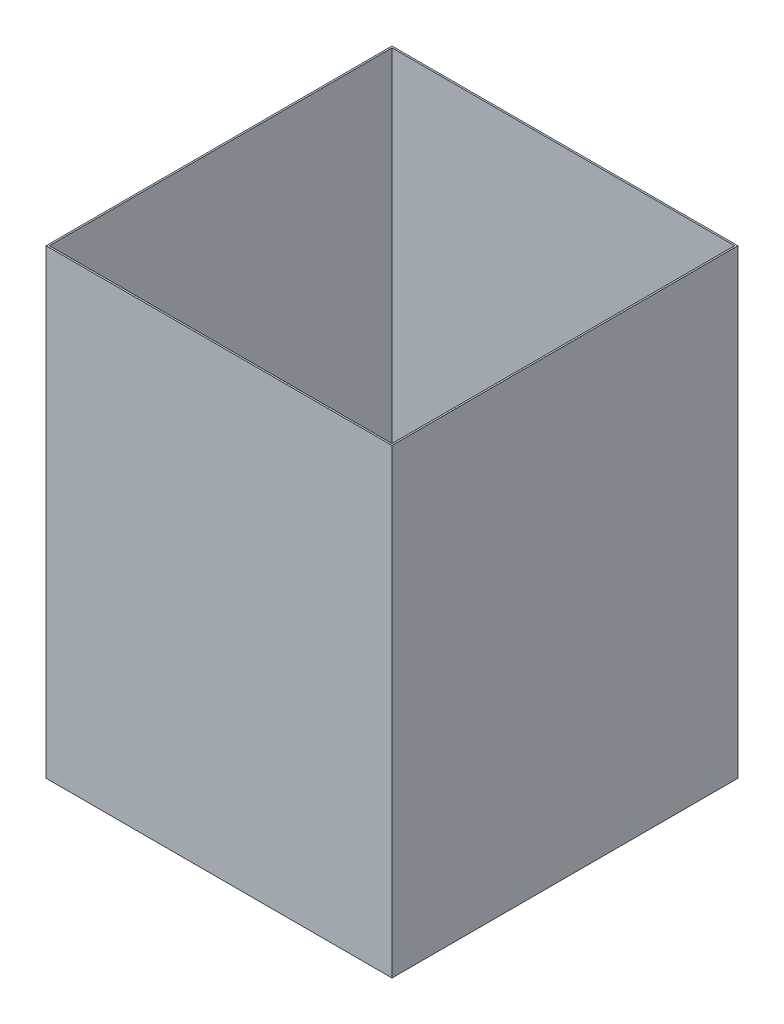
ISO-10303-21;
HEADER;
FILE_DESCRIPTION(('STEP AP214'),'2;1');
FILE_NAME('part.step','',(''),(''),'','','');
FILE_SCHEMA(('AUTOMOTIVE_DESIGN { 1 0 10303 214 1 1 1 1 }'));
ENDSEC;
DATA;
#1=APPLICATION_CONTEXT('core data for automotive mechanical design processes');
#2=APPLICATION_PROTOCOL_DEFINITION('international standard','automotive_design',2000,#1);
#3=PRODUCT_CONTEXT('',#1,'mechanical');
#4=PRODUCT('Part','Part','',(#3));
#5=PRODUCT_RELATED_PRODUCT_CATEGORY('part','',(#4));
#6=PRODUCT_DEFINITION_FORMATION('','',#4);
#7=PRODUCT_DEFINITION_CONTEXT('part definition',#1,'design');
#8=PRODUCT_DEFINITION('design','',#6,#7);
#9=PRODUCT_DEFINITION_SHAPE('','',#8);
#10=(LENGTH_UNIT() NAMED_UNIT(*) SI_UNIT(.MILLI.,.METRE.));
#11=(NAMED_UNIT(*) PLANE_ANGLE_UNIT() SI_UNIT($,.RADIAN.));
#12=(NAMED_UNIT(*) SI_UNIT($,.STERADIAN.) SOLID_ANGLE_UNIT());
#13=UNCERTAINTY_MEASURE_WITH_UNIT(LENGTH_MEASURE(1.E-05),#10,'distance_accuracy_value','');
#14=(GEOMETRIC_REPRESENTATION_CONTEXT(3) GLOBAL_UNCERTAINTY_ASSIGNED_CONTEXT((#13)) GLOBAL_UNIT_ASSIGNED_CONTEXT((#10,
#11,#12)) REPRESENTATION_CONTEXT('',''));
#15=CARTESIAN_POINT('',(0.,0.,0.));
#16=DIRECTION('',(0.,0.,1.));
#17=DIRECTION('',(1.,0.,0.));
#18=AXIS2_PLACEMENT_3D('',#15,#16,#17);
#19=CARTESIAN_POINT('',(50.3277915418978,2000.01,6.91038338410266));
#20=DIRECTION('',(0.,-1.,0.));
#21=DIRECTION('',(0.,0.,-1.));
#22=AXIS2_PLACEMENT_3D('',#19,#20,#21);
#23=CYLINDRICAL_SURFACE('',#22,50.8000000000003);
#24=DIRECTION('',(0.,-1.,0.));
#25=VECTOR('',#24,1.);
#26=CARTESIAN_POINT('',(0.,2000.01,0.));
#27=LINE('',#26,#25);
#28=CARTESIAN_POINT('',(-3.40005801291454E-13,6.9999999999999,0.));
#29=VERTEX_POINT('',#28);
#30=CARTESIAN_POINT('',(-3.33066907387547E-13,0.,0.));
#31=VERTEX_POINT('',#30);
#32=EDGE_CURVE('E12',#29,#31,#27,.T.);
#33=ORIENTED_EDGE('',*,*,#32,.F.);
#34=CARTESIAN_POINT('',(50.3277915418978,6.9999999999999,6.91038338410266));
#35=DIRECTION('',(0.,-1.,0.));
#36=DIRECTION('',(0.,0.,-1.));
#37=AXIS2_PLACEMENT_3D('',#34,#35,#36);
#38=CIRCLE('',#37,50.8000000000003);
#39=CARTESIAN_POINT('',(95.1056516295148,6.9999999999999,30.9016994374964));
#40=VERTEX_POINT('',#39);
#41=EDGE_CURVE('E87',#29,#40,#38,.F.);
#42=ORIENTED_EDGE('',*,*,#41,.T.);
#43=DIRECTION('',(0.,-1.,0.));
#44=VECTOR('',#43,1.);
#45=CARTESIAN_POINT('',(95.1056516295148,1000.005,30.9016994374964));
#46=LINE('',#45,#44);
#47=CARTESIAN_POINT('',(95.1056516295148,0.,30.9016994374964));
#48=VERTEX_POINT('',#47);
#49=EDGE_CURVE('E93',#48,#40,#46,.F.);
#50=ORIENTED_EDGE('',*,*,#49,.F.);
#51=CARTESIAN_POINT('',(50.3277915418978,0.,6.91038338410266));
#52=DIRECTION('',(0.,-1.,0.));
#53=DIRECTION('',(0.,0.,-1.));
#54=AXIS2_PLACEMENT_3D('',#51,#52,#53);
#55=CIRCLE('',#54,50.8000000000003);
#56=EDGE_CURVE('E63',#31,#48,#55,.F.);
#57=ORIENTED_EDGE('',*,*,#56,.F.);
#58=EDGE_LOOP('',(#33,#42,#50,#57));
#59=FACE_BOUND('',#58,.T.);
#60=ADVANCED_FACE('F47',(#59),#23,.F.);
#61=CARTESIAN_POINT('',(8.97997772825103,2000.01,50.0000000000012));
#62=DIRECTION('',(0.,-1.,0.));
#63=DIRECTION('',(0.,0.,-1.));
#64=AXIS2_PLACEMENT_3D('',#61,#62,#63);
#65=CYLINDRICAL_SURFACE('',#64,50.8);
#66=DIRECTION('',(0.,-1.,0.));
#67=VECTOR('',#66,1.);
#68=CARTESIAN_POINT('',(-1.28126675935647E-11,1000.005,100.));
#69=LINE('',#68,#67);
#70=CARTESIAN_POINT('',(-1.28126675935647E-11,6.9999999999999,100.));
#71=VERTEX_POINT('',#70);
#72=CARTESIAN_POINT('',(-1.28126675935647E-11,0.,100.));
#73=VERTEX_POINT('',#72);
#74=EDGE_CURVE('E96',#71,#73,#69,.T.);
#75=ORIENTED_EDGE('',*,*,#74,.F.);
#76=CARTESIAN_POINT('',(8.97997772825103,6.9999999999999,50.0000000000012));
#77=DIRECTION('',(0.,-1.,0.));
#78=DIRECTION('',(0.,0.,-1.));
#79=AXIS2_PLACEMENT_3D('',#76,#77,#78);
#80=CIRCLE('',#79,50.8);
#81=EDGE_CURVE('E89',#71,#29,#80,.T.);
#82=ORIENTED_EDGE('',*,*,#81,.T.);
#83=ORIENTED_EDGE('',*,*,#32,.T.);
#84=CARTESIAN_POINT('',(8.97997772825103,0.,50.0000000000012));
#85=DIRECTION('',(0.,-1.,0.));
#86=DIRECTION('',(0.,0.,-1.));
#87=AXIS2_PLACEMENT_3D('',#84,#85,#86);
#88=CIRCLE('',#87,50.8);
#89=EDGE_CURVE('E69',#73,#31,#88,.T.);
#90=ORIENTED_EDGE('',*,*,#89,.F.);
#91=EDGE_LOOP('',(#75,#82,#83,#90));
#92=FACE_BOUND('',#91,.T.);
#93=ADVANCED_FACE('F103',(#92),#65,.T.);
#94=CARTESIAN_POINT('',(0.,2000.01,0.));
#95=DIRECTION('',(0.,-1.,0.));
#96=DIRECTION('',(0.,0.,-1.));
#97=AXIS2_PLACEMENT_3D('',#94,#95,#96);
#98=CYLINDRICAL_SURFACE('',#97,100.);
#99=CARTESIAN_POINT('',(0.,6.9999999999999,0.));
#100=DIRECTION('',(0.,-1.,0.));
#101=DIRECTION('',(0.,0.,-1.));
#102=AXIS2_PLACEMENT_3D('',#99,#100,#101);
#103=CIRCLE('',#102,100.);
#104=EDGE_CURVE('E51',#40,#71,#103,.T.);
#105=ORIENTED_EDGE('',*,*,#104,.T.);
#106=ORIENTED_EDGE('',*,*,#74,.T.);
#107=CARTESIAN_POINT('',(0.,0.,0.));
#108=DIRECTION('',(0.,-1.,0.));
#109=DIRECTION('',(0.,0.,-1.));
#110=AXIS2_PLACEMENT_3D('',#107,#108,#109);
#111=CIRCLE('',#110,100.);
#112=EDGE_CURVE('E91',#48,#73,#111,.T.);
#113=ORIENTED_EDGE('',*,*,#112,.F.);
#114=ORIENTED_EDGE('',*,*,#49,.T.);
#115=EDGE_LOOP('',(#105,#106,#113,#114));
#116=FACE_BOUND('',#115,.T.);
#117=ADVANCED_FACE('F94',(#116),#98,.T.);
#118=CARTESIAN_POINT('',(0.,0.,0.));
#119=DIRECTION('',(0.,-1.,0.));
#120=DIRECTION('',(0.,0.,-1.));
#121=AXIS2_PLACEMENT_3D('',#118,#119,#120);
#122=PLANE('',#121);
#123=ORIENTED_EDGE('',*,*,#112,.T.);
#124=ORIENTED_EDGE('',*,*,#89,.T.);
#125=ORIENTED_EDGE('',*,*,#56,.T.);
#126=EDGE_LOOP('',(#123,#124,#125));
#127=FACE_BOUND('',#126,.T.);
#128=ADVANCED_FACE('F49',(#127),#122,.T.);
#129=CARTESIAN_POINT('',(0.,6.9999999999999,0.));
#130=DIRECTION('',(0.,-1.,0.));
#131=DIRECTION('',(0.,0.,-1.));
#132=AXIS2_PLACEMENT_3D('',#129,#130,#131);
#133=PLANE('',#132);
#134=ORIENTED_EDGE('',*,*,#81,.F.);
#135=ORIENTED_EDGE('',*,*,#104,.F.);
#136=ORIENTED_EDGE('',*,*,#41,.F.);
#137=EDGE_LOOP('',(#134,#135,#136));
#138=FACE_BOUND('',#137,.T.);
#139=ADVANCED_FACE('F85',(#138),#133,.F.);
#140=CLOSED_SHELL('',(#60,#93,#117,#128,#139));
#141=MANIFOLD_SOLID_BREP('B2',#140);
#142=CARTESIAN_POINT('',(-44.7778600876174,2000.01,23.991316053393));
#143=DIRECTION('',(0.,-1.,0.));
#144=DIRECTION('',(0.,0.,-1.));
#145=AXIS2_PLACEMENT_3D('',#142,#143,#144);
#146=CYLINDRICAL_SURFACE('',#145,50.8000000000001);
#147=DIRECTION('',(0.,-1.,0.));
#148=VECTOR('',#147,1.);
#149=CARTESIAN_POINT('',(0.,2000.01,0.));
#150=LINE('',#149,#148);
#151=CARTESIAN_POINT('',(-3.40005801291454E-13,6.9999999999999,0.));
#152=VERTEX_POINT('',#151);
#153=CARTESIAN_POINT('',(-3.33066907387547E-13,0.,0.));
#154=VERTEX_POINT('',#153);
#155=EDGE_CURVE('E199',#152,#154,#150,.T.);
#156=ORIENTED_EDGE('',*,*,#155,.F.);
#157=CARTESIAN_POINT('',(-44.7778600876174,6.9999999999999,23.991316053393));
#158=DIRECTION('',(0.,-1.,0.));
#159=DIRECTION('',(0.,0.,-1.));
#160=AXIS2_PLACEMENT_3D('',#157,#158,#159);
#161=CIRCLE('',#160,50.8000000000001);
#162=CARTESIAN_POINT('',(-95.1056516295154,6.9999999999999,30.9016994374946));
#163=VERTEX_POINT('',#162);
#164=EDGE_CURVE('E188',#152,#163,#161,.F.);
#165=ORIENTED_EDGE('',*,*,#164,.T.);
#166=DIRECTION('',(0.,-1.,0.));
#167=VECTOR('',#166,1.);
#168=CARTESIAN_POINT('',(-95.1056516295154,1000.005,30.9016994374946));
#169=LINE('',#168,#167);
#170=CARTESIAN_POINT('',(-95.1056516295154,0.,30.9016994374946));
#171=VERTEX_POINT('',#170);
#172=EDGE_CURVE('E193',#171,#163,#169,.F.);
#173=ORIENTED_EDGE('',*,*,#172,.F.);
#174=CARTESIAN_POINT('',(-44.7778600876174,0.,23.991316053393));
#175=DIRECTION('',(0.,-1.,0.));
#176=DIRECTION('',(0.,0.,-1.));
#177=AXIS2_PLACEMENT_3D('',#174,#175,#176);
#178=CIRCLE('',#177,50.8000000000001);
#179=EDGE_CURVE('E197',#154,#171,#178,.F.);
#180=ORIENTED_EDGE('',*,*,#179,.F.);
#181=EDGE_LOOP('',(#156,#165,#173,#180));
#182=FACE_BOUND('',#181,.T.);
#183=ADVANCED_FACE('F154',(#182),#146,.F.);
#184=CARTESIAN_POINT('',(0.,2000.01,0.));
#185=DIRECTION('',(0.,-1.,0.));
#186=DIRECTION('',(0.,0.,-1.));
#187=AXIS2_PLACEMENT_3D('',#184,#185,#186);
#188=CYLINDRICAL_SURFACE('',#187,100.);
#189=CARTESIAN_POINT('',(0.,0.,0.));
#190=DIRECTION('',(0.,-1.,0.));
#191=DIRECTION('',(0.,0.,-1.));
#192=AXIS2_PLACEMENT_3D('',#189,#190,#191);
#193=CIRCLE('',#192,100.);
#194=CARTESIAN_POINT('',(-58.7785252292471,0.,-80.9016994374949));
#195=VERTEX_POINT('',#194);
#196=EDGE_CURVE('E162',#171,#195,#193,.T.);
#197=ORIENTED_EDGE('',*,*,#196,.F.);
#198=ORIENTED_EDGE('',*,*,#172,.T.);
#199=CARTESIAN_POINT('',(0.,6.9999999999999,0.));
#200=DIRECTION('',(0.,-1.,0.));
#201=DIRECTION('',(0.,0.,-1.));
#202=AXIS2_PLACEMENT_3D('',#199,#200,#201);
#203=CIRCLE('',#202,100.);
#204=CARTESIAN_POINT('',(-58.7785252292471,6.9999999999999,-80.9016994374949));
#205=VERTEX_POINT('',#204);
#206=EDGE_CURVE('E45',#163,#205,#203,.T.);
#207=ORIENTED_EDGE('',*,*,#206,.T.);
#208=DIRECTION('',(0.,-1.,0.));
#209=VECTOR('',#208,1.);
#210=CARTESIAN_POINT('',(-58.7785252292471,1000.005,-80.9016994374949));
#211=LINE('',#210,#209);
#212=EDGE_CURVE('E202',#195,#205,#211,.F.);
#213=ORIENTED_EDGE('',*,*,#212,.F.);
#214=EDGE_LOOP('',(#197,#198,#207,#213));
#215=FACE_BOUND('',#214,.T.);
#216=ADVANCED_FACE('F194',(#215),#188,.T.);
#217=CARTESIAN_POINT('',(-36.6542172058933,2000.01,-35.1725512441624));
#218=DIRECTION('',(0.,-1.,0.));
#219=DIRECTION('',(0.,0.,-1.));
#220=AXIS2_PLACEMENT_3D('',#217,#218,#219);
#221=CYLINDRICAL_SURFACE('',#220,50.8000000000001);
#222=ORIENTED_EDGE('',*,*,#155,.T.);
#223=CARTESIAN_POINT('',(-36.6542172058933,0.,-35.1725512441624));
#224=DIRECTION('',(0.,-1.,0.));
#225=DIRECTION('',(0.,0.,-1.));
#226=AXIS2_PLACEMENT_3D('',#223,#224,#225);
#227=CIRCLE('',#226,50.8000000000001);
#228=EDGE_CURVE('E204',#154,#195,#227,.F.);
#229=ORIENTED_EDGE('',*,*,#228,.T.);
#230=ORIENTED_EDGE('',*,*,#212,.T.);
#231=CARTESIAN_POINT('',(-36.6542172058933,6.9999999999999,-35.1725512441624));
#232=DIRECTION('',(0.,-1.,0.));
#233=DIRECTION('',(0.,0.,-1.));
#234=AXIS2_PLACEMENT_3D('',#231,#232,#233);
#235=CIRCLE('',#234,50.8000000000001);
#236=EDGE_CURVE('E190',#152,#205,#235,.F.);
#237=ORIENTED_EDGE('',*,*,#236,.F.);
#238=EDGE_LOOP('',(#222,#229,#230,#237));
#239=FACE_BOUND('',#238,.T.);
#240=ADVANCED_FACE('F210',(#239),#221,.T.);
#241=CARTESIAN_POINT('',(0.,0.,0.));
#242=DIRECTION('',(0.,-1.,0.));
#243=DIRECTION('',(0.,0.,-1.));
#244=AXIS2_PLACEMENT_3D('',#241,#242,#243);
#245=PLANE('',#244);
#246=ORIENTED_EDGE('',*,*,#228,.F.);
#247=ORIENTED_EDGE('',*,*,#179,.T.);
#248=ORIENTED_EDGE('',*,*,#196,.T.);
#249=EDGE_LOOP('',(#246,#247,#248));
#250=FACE_BOUND('',#249,.T.);
#251=ADVANCED_FACE('F156',(#250),#245,.T.);
#252=CARTESIAN_POINT('',(0.,6.9999999999999,0.));
#253=DIRECTION('',(0.,-1.,0.));
#254=DIRECTION('',(0.,0.,-1.));
#255=AXIS2_PLACEMENT_3D('',#252,#253,#254);
#256=PLANE('',#255);
#257=ORIENTED_EDGE('',*,*,#164,.F.);
#258=ORIENTED_EDGE('',*,*,#236,.T.);
#259=ORIENTED_EDGE('',*,*,#206,.F.);
#260=EDGE_LOOP('',(#257,#258,#259));
#261=FACE_BOUND('',#260,.T.);
#262=ADVANCED_FACE('F186',(#261),#256,.F.);
#263=CLOSED_SHELL('',(#183,#216,#240,#251,#262));
#264=MANIFOLD_SOLID_BREP('B6',#263);
#265=CARTESIAN_POINT('',(-44.7778600876174,2000.01,23.991316053393));
#266=DIRECTION('',(0.,-1.,0.));
#267=DIRECTION('',(0.,0.,-1.));
#268=AXIS2_PLACEMENT_3D('',#265,#266,#267);
#269=CYLINDRICAL_SURFACE('',#268,50.8000000000001);
#270=DIRECTION('',(0.,-1.,0.));
#271=VECTOR('',#270,1.);
#272=CARTESIAN_POINT('',(0.,2000.01,0.));
#273=LINE('',#272,#271);
#274=CARTESIAN_POINT('',(-3.40005801291454E-13,6.9999999999999,0.));
#275=VERTEX_POINT('',#274);
#276=CARTESIAN_POINT('',(-3.33066907387547E-13,0.,0.));
#277=VERTEX_POINT('',#276);
#278=EDGE_CURVE('E152',#275,#277,#273,.T.);
#279=ORIENTED_EDGE('',*,*,#278,.T.);
#280=CARTESIAN_POINT('',(-44.7778600876174,0.,23.991316053393));
#281=DIRECTION('',(0.,-1.,0.));
#282=DIRECTION('',(0.,0.,-1.));
#283=AXIS2_PLACEMENT_3D('',#280,#281,#282);
#284=CIRCLE('',#283,50.8000000000001);
#285=CARTESIAN_POINT('',(-95.1056516295154,0.,30.9016994374946));
#286=VERTEX_POINT('',#285);
#287=EDGE_CURVE('E269',#277,#286,#284,.F.);
#288=ORIENTED_EDGE('',*,*,#287,.T.);
#289=DIRECTION('',(0.,-1.,0.));
#290=VECTOR('',#289,1.);
#291=CARTESIAN_POINT('',(-95.1056516295154,1000.005,30.9016994374946));
#292=LINE('',#291,#290);
#293=CARTESIAN_POINT('',(-95.1056516295154,6.9999999999999,30.9016994374946));
#294=VERTEX_POINT('',#293);
#295=EDGE_CURVE('E316',#286,#294,#292,.F.);
#296=ORIENTED_EDGE('',*,*,#295,.T.);
#297=CARTESIAN_POINT('',(-44.7778600876174,6.9999999999999,23.991316053393));
#298=DIRECTION('',(0.,-1.,0.));
#299=DIRECTION('',(0.,0.,-1.));
#300=AXIS2_PLACEMENT_3D('',#297,#298,#299);
#301=CIRCLE('',#300,50.8000000000001);
#302=EDGE_CURVE('E264',#275,#294,#301,.F.);
#303=ORIENTED_EDGE('',*,*,#302,.F.);
#304=EDGE_LOOP('',(#279,#288,#296,#303));
#305=FACE_BOUND('',#304,.T.);
#306=ADVANCED_FACE('F261',(#305),#269,.T.);
#307=CARTESIAN_POINT('',(8.97997772825103,2000.01,50.0000000000012));
#308=DIRECTION('',(0.,-1.,0.));
#309=DIRECTION('',(0.,0.,-1.));
#310=AXIS2_PLACEMENT_3D('',#307,#308,#309);
#311=CYLINDRICAL_SURFACE('',#310,50.8);
#312=DIRECTION('',(0.,-1.,0.));
#313=VECTOR('',#312,1.);
#314=CARTESIAN_POINT('',(-1.28126675935647E-11,1000.005,100.));
#315=LINE('',#314,#313);
#316=CARTESIAN_POINT('',(-1.28126675935647E-11,6.9999999999999,100.));
#317=VERTEX_POINT('',#316);
#318=CARTESIAN_POINT('',(-1.28126675935647E-11,0.,100.));
#319=VERTEX_POINT('',#318);
#320=EDGE_CURVE('E299',#317,#319,#315,.T.);
#321=ORIENTED_EDGE('',*,*,#320,.T.);
#322=CARTESIAN_POINT('',(8.97997772825103,0.,50.0000000000012));
#323=DIRECTION('',(0.,-1.,0.));
#324=DIRECTION('',(0.,0.,-1.));
#325=AXIS2_PLACEMENT_3D('',#322,#323,#324);
#326=CIRCLE('',#325,50.8);
#327=EDGE_CURVE('E309',#319,#277,#326,.T.);
#328=ORIENTED_EDGE('',*,*,#327,.T.);
#329=ORIENTED_EDGE('',*,*,#278,.F.);
#330=CARTESIAN_POINT('',(8.97997772825103,6.9999999999999,50.0000000000012));
#331=DIRECTION('',(0.,-1.,0.));
#332=DIRECTION('',(0.,0.,-1.));
#333=AXIS2_PLACEMENT_3D('',#330,#331,#332);
#334=CIRCLE('',#333,50.8);
#335=EDGE_CURVE('E295',#317,#275,#334,.T.);
#336=ORIENTED_EDGE('',*,*,#335,.F.);
#337=EDGE_LOOP('',(#321,#328,#329,#336));
#338=FACE_BOUND('',#337,.T.);
#339=ADVANCED_FACE('F297',(#338),#311,.F.);
#340=CARTESIAN_POINT('',(0.,2000.01,0.));
#341=DIRECTION('',(0.,-1.,0.));
#342=DIRECTION('',(0.,0.,-1.));
#343=AXIS2_PLACEMENT_3D('',#340,#341,#342);
#344=CYLINDRICAL_SURFACE('',#343,100.);
#345=ORIENTED_EDGE('',*,*,#295,.F.);
#346=CARTESIAN_POINT('',(0.,0.,0.));
#347=DIRECTION('',(0.,-1.,0.));
#348=DIRECTION('',(0.,0.,-1.));
#349=AXIS2_PLACEMENT_3D('',#346,#347,#348);
#350=CIRCLE('',#349,100.);
#351=EDGE_CURVE('E303',#319,#286,#350,.T.);
#352=ORIENTED_EDGE('',*,*,#351,.F.);
#353=ORIENTED_EDGE('',*,*,#320,.F.);
#354=CARTESIAN_POINT('',(0.,6.9999999999999,0.));
#355=DIRECTION('',(0.,-1.,0.));
#356=DIRECTION('',(0.,0.,-1.));
#357=AXIS2_PLACEMENT_3D('',#354,#355,#356);
#358=CIRCLE('',#357,100.);
#359=EDGE_CURVE('E308',#317,#294,#358,.T.);
#360=ORIENTED_EDGE('',*,*,#359,.T.);
#361=EDGE_LOOP('',(#345,#352,#353,#360));
#362=FACE_BOUND('',#361,.T.);
#363=ADVANCED_FACE('F307',(#362),#344,.T.);
#364=CARTESIAN_POINT('',(0.,6.9999999999999,0.));
#365=DIRECTION('',(0.,-1.,0.));
#366=DIRECTION('',(0.,0.,-1.));
#367=AXIS2_PLACEMENT_3D('',#364,#365,#366);
#368=PLANE('',#367);
#369=ORIENTED_EDGE('',*,*,#335,.T.);
#370=ORIENTED_EDGE('',*,*,#302,.T.);
#371=ORIENTED_EDGE('',*,*,#359,.F.);
#372=EDGE_LOOP('',(#369,#370,#371));
#373=FACE_BOUND('',#372,.T.);
#374=ADVANCED_FACE('F311',(#373),#368,.F.);
#375=CARTESIAN_POINT('',(0.,0.,0.));
#376=DIRECTION('',(0.,-1.,0.));
#377=DIRECTION('',(0.,0.,-1.));
#378=AXIS2_PLACEMENT_3D('',#375,#376,#377);
#379=PLANE('',#378);
#380=ORIENTED_EDGE('',*,*,#287,.F.);
#381=ORIENTED_EDGE('',*,*,#327,.F.);
#382=ORIENTED_EDGE('',*,*,#351,.T.);
#383=EDGE_LOOP('',(#380,#381,#382));
#384=FACE_BOUND('',#383,.T.);
#385=ADVANCED_FACE('F317',(#384),#379,.T.);
#386=CLOSED_SHELL('',(#306,#339,#363,#374,#385));
#387=MANIFOLD_SOLID_BREP('B39',#386);
#388=CARTESIAN_POINT('',(22.1243080233546,7.00999999999989,-45.7291481933321));
#389=DIRECTION('',(0.,-1.,0.));
#390=DIRECTION('',(0.,0.,-1.));
#391=AXIS2_PLACEMENT_3D('',#388,#389,#390);
#392=CYLINDRICAL_SURFACE('',#391,50.8);
#393=DIRECTION('',(0.,-1.,0.));
#394=VECTOR('',#393,1.);
#395=CARTESIAN_POINT('',(0.,2000.01,0.));
#396=LINE('',#395,#394);
#397=CARTESIAN_POINT('',(-3.40005801291454E-13,6.9999999999999,0.));
#398=VERTEX_POINT('',#397);
#399=CARTESIAN_POINT('',(-3.33066907387547E-13,0.,0.));
#400=VERTEX_POINT('',#399);
#401=EDGE_CURVE('E389',#398,#400,#396,.T.);
#402=ORIENTED_EDGE('',*,*,#401,.F.);
#403=CARTESIAN_POINT('',(22.1243080233546,6.9999999999999,-45.7291481933321));
#404=DIRECTION('',(0.,-1.,0.));
#405=DIRECTION('',(0.,0.,-1.));
#406=AXIS2_PLACEMENT_3D('',#403,#404,#405);
#407=CIRCLE('',#406,50.8);
#408=CARTESIAN_POINT('',(58.7785252292471,6.9999999999999,-80.9016994374949));
#409=VERTEX_POINT('',#408);
#410=EDGE_CURVE('E402',#398,#409,#407,.F.);
#411=ORIENTED_EDGE('',*,*,#410,.T.);
#412=DIRECTION('',(0.,-1.,0.));
#413=VECTOR('',#412,1.);
#414=CARTESIAN_POINT('',(58.7785252292471,3.50499999999995,-80.9016994374949));
#415=LINE('',#414,#413);
#416=CARTESIAN_POINT('',(58.7785252292471,0.,-80.9016994374949));
#417=VERTEX_POINT('',#416);
#418=EDGE_CURVE('E408',#417,#409,#415,.F.);
#419=ORIENTED_EDGE('',*,*,#418,.F.);
#420=CARTESIAN_POINT('',(22.1243080233546,0.,-45.7291481933321));
#421=DIRECTION('',(0.,-1.,0.));
#422=DIRECTION('',(0.,0.,-1.));
#423=AXIS2_PLACEMENT_3D('',#420,#421,#422);
#424=CIRCLE('',#423,50.8);
#425=EDGE_CURVE('E410',#400,#417,#424,.F.);
#426=ORIENTED_EDGE('',*,*,#425,.F.);
#427=EDGE_LOOP('',(#402,#411,#419,#426));
#428=FACE_BOUND('',#427,.T.);
#429=ADVANCED_FACE('F368',(#428),#392,.F.);
#430=CARTESIAN_POINT('',(0.,2000.01,0.));
#431=DIRECTION('',(0.,-1.,0.));
#432=DIRECTION('',(0.,0.,-1.));
#433=AXIS2_PLACEMENT_3D('',#430,#431,#432);
#434=CYLINDRICAL_SURFACE('',#433,100.);
#435=CARTESIAN_POINT('',(0.,0.,0.));
#436=DIRECTION('',(0.,-1.,0.));
#437=DIRECTION('',(0.,0.,-1.));
#438=AXIS2_PLACEMENT_3D('',#435,#436,#437);
#439=CIRCLE('',#438,100.);
#440=CARTESIAN_POINT('',(95.1056516295148,0.,30.9016994374964));
#441=VERTEX_POINT('',#440);
#442=EDGE_CURVE('E376',#417,#441,#439,.T.);
#443=ORIENTED_EDGE('',*,*,#442,.F.);
#444=ORIENTED_EDGE('',*,*,#418,.T.);
#445=CARTESIAN_POINT('',(0.,6.9999999999999,0.));
#446=DIRECTION('',(0.,-1.,0.));
#447=DIRECTION('',(0.,0.,-1.));
#448=AXIS2_PLACEMENT_3D('',#445,#446,#447);
#449=CIRCLE('',#448,100.);
#450=CARTESIAN_POINT('',(95.1056516295148,6.9999999999999,30.9016994374964));
#451=VERTEX_POINT('',#450);
#452=EDGE_CURVE('E259',#409,#451,#449,.T.);
#453=ORIENTED_EDGE('',*,*,#452,.T.);
#454=DIRECTION('',(0.,-1.,0.));
#455=VECTOR('',#454,1.);
#456=CARTESIAN_POINT('',(95.1056516295148,1000.005,30.9016994374964));
#457=LINE('',#456,#455);
#458=EDGE_CURVE('E416',#441,#451,#457,.F.);
#459=ORIENTED_EDGE('',*,*,#458,.F.);
#460=EDGE_LOOP('',(#443,#444,#453,#459));
#461=FACE_BOUND('',#460,.T.);
#462=ADVANCED_FACE('F409',(#461),#434,.T.);
#463=CARTESIAN_POINT('',(50.3277915418978,2000.01,6.91038338410266));
#464=DIRECTION('',(0.,-1.,0.));
#465=DIRECTION('',(0.,0.,-1.));
#466=AXIS2_PLACEMENT_3D('',#463,#464,#465);
#467=CYLINDRICAL_SURFACE('',#466,50.8000000000003);
#468=ORIENTED_EDGE('',*,*,#401,.T.);
#469=CARTESIAN_POINT('',(50.3277915418978,0.,6.91038338410266));
#470=DIRECTION('',(0.,-1.,0.));
#471=DIRECTION('',(0.,0.,-1.));
#472=AXIS2_PLACEMENT_3D('',#469,#470,#471);
#473=CIRCLE('',#472,50.8000000000003);
#474=EDGE_CURVE('E418',#400,#441,#473,.F.);
#475=ORIENTED_EDGE('',*,*,#474,.T.);
#476=ORIENTED_EDGE('',*,*,#458,.T.);
#477=CARTESIAN_POINT('',(50.3277915418978,6.9999999999999,6.91038338410266));
#478=DIRECTION('',(0.,-1.,0.));
#479=DIRECTION('',(0.,0.,-1.));
#480=AXIS2_PLACEMENT_3D('',#477,#478,#479);
#481=CIRCLE('',#480,50.8000000000003);
#482=EDGE_CURVE('E404',#398,#451,#481,.F.);
#483=ORIENTED_EDGE('',*,*,#482,.F.);
#484=EDGE_LOOP('',(#468,#475,#476,#483));
#485=FACE_BOUND('',#484,.T.);
#486=ADVANCED_FACE('F424',(#485),#467,.T.);
#487=CARTESIAN_POINT('',(0.,0.,0.));
#488=DIRECTION('',(0.,-1.,0.));
#489=DIRECTION('',(0.,0.,-1.));
#490=AXIS2_PLACEMENT_3D('',#487,#488,#489);
#491=PLANE('',#490);
#492=ORIENTED_EDGE('',*,*,#474,.F.);
#493=ORIENTED_EDGE('',*,*,#425,.T.);
#494=ORIENTED_EDGE('',*,*,#442,.T.);
#495=EDGE_LOOP('',(#492,#493,#494));
#496=FACE_BOUND('',#495,.T.);
#497=ADVANCED_FACE('F370',(#496),#491,.T.);
#498=CARTESIAN_POINT('',(0.,6.9999999999999,0.));
#499=DIRECTION('',(0.,-1.,0.));
#500=DIRECTION('',(0.,0.,-1.));
#501=AXIS2_PLACEMENT_3D('',#498,#499,#500);
#502=PLANE('',#501);
#503=ORIENTED_EDGE('',*,*,#410,.F.);
#504=ORIENTED_EDGE('',*,*,#482,.T.);
#505=ORIENTED_EDGE('',*,*,#452,.F.);
#506=EDGE_LOOP('',(#503,#504,#505));
#507=FACE_BOUND('',#506,.T.);
#508=ADVANCED_FACE('F401',(#507),#502,.F.);
#509=CLOSED_SHELL('',(#429,#462,#486,#497,#508));
#510=MANIFOLD_SOLID_BREP('B146',#509);
#511=CARTESIAN_POINT('',(0.,2000.01,0.));
#512=DIRECTION('',(0.,-1.,0.));
#513=DIRECTION('',(0.,0.,-1.));
#514=AXIS2_PLACEMENT_3D('',#511,#512,#513);
#515=CYLINDRICAL_SURFACE('',#514,100.);
#516=CARTESIAN_POINT('',(0.,6.9999999999999,0.));
#517=DIRECTION('',(0.,-1.,0.));
#518=DIRECTION('',(0.,0.,-1.));
#519=AXIS2_PLACEMENT_3D('',#516,#517,#518);
#520=CIRCLE('',#519,100.);
#521=CARTESIAN_POINT('',(0.,6.9999999999999,-100.));
#522=VERTEX_POINT('',#521);
#523=EDGE_CURVE('E481',#522,#522,#520,.T.);
#524=ORIENTED_EDGE('',*,*,#523,.F.);
#525=EDGE_LOOP('',(#524));
#526=FACE_BOUND('',#525,.T.);
#527=CARTESIAN_POINT('',(0.,0.,0.));
#528=DIRECTION('',(0.,-1.,0.));
#529=DIRECTION('',(0.,0.,-1.));
#530=AXIS2_PLACEMENT_3D('',#527,#528,#529);
#531=CIRCLE('',#530,100.);
#532=CARTESIAN_POINT('',(0.,0.,-100.));
#533=VERTEX_POINT('',#532);
#534=EDGE_CURVE('E366',#533,#533,#531,.T.);
#535=ORIENTED_EDGE('',*,*,#534,.T.);
#536=EDGE_LOOP('',(#535));
#537=FACE_BOUND('',#536,.T.);
#538=ADVANCED_FACE('F474',(#526,#537),#515,.F.);
#539=CARTESIAN_POINT('',(0.,2000.,0.));
#540=DIRECTION('',(0.,-1.,0.));
#541=DIRECTION('',(0.,0.,-1.));
#542=AXIS2_PLACEMENT_3D('',#539,#540,#541);
#543=PLANE('',#542);
#544=DIRECTION('',(-1.,0.,0.));
#545=VECTOR('',#544,1.);
#546=CARTESIAN_POINT('',(-743.,2000.,-743.));
#547=LINE('',#546,#545);
#548=CARTESIAN_POINT('',(743.,2000.,-743.));
#549=VERTEX_POINT('',#548);
#550=CARTESIAN_POINT('',(-743.,2000.,-743.));
#551=VERTEX_POINT('',#550);
#552=EDGE_CURVE('E577',#549,#551,#547,.T.);
#553=ORIENTED_EDGE('',*,*,#552,.F.);
#554=DIRECTION('',(0.,0.,-1.));
#555=VECTOR('',#554,1.);
#556=CARTESIAN_POINT('',(743.,2000.,743.));
#557=LINE('',#556,#555);
#558=CARTESIAN_POINT('',(743.,2000.,743.));
#559=VERTEX_POINT('',#558);
#560=EDGE_CURVE('E488',#559,#549,#557,.T.);
#561=ORIENTED_EDGE('',*,*,#560,.F.);
#562=DIRECTION('',(1.,0.,0.));
#563=VECTOR('',#562,1.);
#564=CARTESIAN_POINT('',(-743.,2000.,743.));
#565=LINE('',#564,#563);
#566=CARTESIAN_POINT('',(-743.,2000.,743.));
#567=VERTEX_POINT('',#566);
#568=EDGE_CURVE('E568',#567,#559,#565,.T.);
#569=ORIENTED_EDGE('',*,*,#568,.F.);
#570=DIRECTION('',(0.,0.,1.));
#571=VECTOR('',#570,1.);
#572=CARTESIAN_POINT('',(-743.,2000.,743.));
#573=LINE('',#572,#571);
#574=EDGE_CURVE('E571',#551,#567,#573,.T.);
#575=ORIENTED_EDGE('',*,*,#574,.F.);
#576=EDGE_LOOP('',(#553,#561,#569,#575));
#577=FACE_BOUND('',#576,.T.);
#578=DIRECTION('',(0.,0.,-1.));
#579=VECTOR('',#578,1.);
#580=CARTESIAN_POINT('',(750.,2000.,750.));
#581=LINE('',#580,#579);
#582=CARTESIAN_POINT('',(750.,2000.,750.));
#583=VERTEX_POINT('',#582);
#584=CARTESIAN_POINT('',(750.,2000.,-750.));
#585=VERTEX_POINT('',#584);
#586=EDGE_CURVE('E587',#583,#585,#581,.T.);
#587=ORIENTED_EDGE('',*,*,#586,.T.);
#588=DIRECTION('',(-1.,0.,0.));
#589=VECTOR('',#588,1.);
#590=CARTESIAN_POINT('',(-750.,2000.,-750.));
#591=LINE('',#590,#589);
#592=CARTESIAN_POINT('',(-750.,2000.,-750.));
#593=VERTEX_POINT('',#592);
#594=EDGE_CURVE('E526',#585,#593,#591,.T.);
#595=ORIENTED_EDGE('',*,*,#594,.T.);
#596=DIRECTION('',(0.,0.,1.));
#597=VECTOR('',#596,1.);
#598=CARTESIAN_POINT('',(-750.,2000.,750.));
#599=LINE('',#598,#597);
#600=CARTESIAN_POINT('',(-750.,2000.,750.));
#601=VERTEX_POINT('',#600);
#602=EDGE_CURVE('E590',#593,#601,#599,.T.);
#603=ORIENTED_EDGE('',*,*,#602,.T.);
#604=DIRECTION('',(1.,0.,0.));
#605=VECTOR('',#604,1.);
#606=CARTESIAN_POINT('',(-750.,2000.,750.));
#607=LINE('',#606,#605);
#608=EDGE_CURVE('E497',#601,#583,#607,.T.);
#609=ORIENTED_EDGE('',*,*,#608,.T.);
#610=EDGE_LOOP('',(#587,#595,#603,#609));
#611=FACE_BOUND('',#610,.T.);
#612=ADVANCED_FACE('F614',(#577,#611),#543,.F.);
#613=CARTESIAN_POINT('',(-743.,6.9999999999999,743.));
#614=DIRECTION('',(0.,0.,1.));
#615=DIRECTION('',(1.,0.,0.));
#616=AXIS2_PLACEMENT_3D('',#613,#614,#615);
#617=PLANE('',#616);
#618=ORIENTED_EDGE('',*,*,#568,.T.);
#619=DIRECTION('',(0.,1.,0.));
#620=VECTOR('',#619,1.);
#621=CARTESIAN_POINT('',(743.,6.9999999999999,743.));
#622=LINE('',#621,#620);
#623=CARTESIAN_POINT('',(743.,6.9999999999999,743.));
#624=VERTEX_POINT('',#623);
#625=EDGE_CURVE('E581',#624,#559,#622,.T.);
#626=ORIENTED_EDGE('',*,*,#625,.F.);
#627=DIRECTION('',(1.,0.,0.));
#628=VECTOR('',#627,1.);
#629=CARTESIAN_POINT('',(-743.,6.9999999999999,743.));
#630=LINE('',#629,#628);
#631=CARTESIAN_POINT('',(-743.,6.9999999999999,743.));
#632=VERTEX_POINT('',#631);
#633=EDGE_CURVE('E556',#632,#624,#630,.T.);
#634=ORIENTED_EDGE('',*,*,#633,.F.);
#635=DIRECTION('',(0.,1.,0.));
#636=VECTOR('',#635,1.);
#637=CARTESIAN_POINT('',(-743.,6.9999999999999,743.));
#638=LINE('',#637,#636);
#639=EDGE_CURVE('E584',#632,#567,#638,.T.);
#640=ORIENTED_EDGE('',*,*,#639,.T.);
#641=EDGE_LOOP('',(#618,#626,#634,#640));
#642=FACE_BOUND('',#641,.T.);
#643=ADVANCED_FACE('F651',(#642),#617,.F.);
#644=CARTESIAN_POINT('',(-743.,6.9999999999999,743.));
#645=DIRECTION('',(-1.,0.,0.));
#646=DIRECTION('',(0.,0.,1.));
#647=AXIS2_PLACEMENT_3D('',#644,#645,#646);
#648=PLANE('',#647);
#649=ORIENTED_EDGE('',*,*,#574,.T.);
#650=ORIENTED_EDGE('',*,*,#639,.F.);
#651=DIRECTION('',(0.,0.,1.));
#652=VECTOR('',#651,1.);
#653=CARTESIAN_POINT('',(-743.,6.9999999999999,743.));
#654=LINE('',#653,#652);
#655=CARTESIAN_POINT('',(-743.,6.9999999999999,-743.));
#656=VERTEX_POINT('',#655);
#657=EDGE_CURVE('E564',#656,#632,#654,.T.);
#658=ORIENTED_EDGE('',*,*,#657,.F.);
#659=DIRECTION('',(0.,1.,0.));
#660=VECTOR('',#659,1.);
#661=CARTESIAN_POINT('',(-743.,6.9999999999999,-743.));
#662=LINE('',#661,#660);
#663=EDGE_CURVE('E555',#656,#551,#662,.T.);
#664=ORIENTED_EDGE('',*,*,#663,.T.);
#665=EDGE_LOOP('',(#649,#650,#658,#664));
#666=FACE_BOUND('',#665,.T.);
#667=ADVANCED_FACE('F657',(#666),#648,.F.);
#668=CARTESIAN_POINT('',(-743.,6.9999999999999,-743.));
#669=DIRECTION('',(0.,0.,-1.));
#670=DIRECTION('',(-1.,0.,0.));
#671=AXIS2_PLACEMENT_3D('',#668,#669,#670);
#672=PLANE('',#671);
#673=ORIENTED_EDGE('',*,*,#552,.T.);
#674=ORIENTED_EDGE('',*,*,#663,.F.);
#675=DIRECTION('',(-1.,0.,0.));
#676=VECTOR('',#675,1.);
#677=CARTESIAN_POINT('',(-743.,6.9999999999999,-743.));
#678=LINE('',#677,#676);
#679=CARTESIAN_POINT('',(743.,6.9999999999999,-743.));
#680=VERTEX_POINT('',#679);
#681=EDGE_CURVE('E559',#680,#656,#678,.T.);
#682=ORIENTED_EDGE('',*,*,#681,.F.);
#683=DIRECTION('',(0.,1.,0.));
#684=VECTOR('',#683,1.);
#685=CARTESIAN_POINT('',(743.,6.9999999999999,-743.));
#686=LINE('',#685,#684);
#687=EDGE_CURVE('E546',#680,#549,#686,.T.);
#688=ORIENTED_EDGE('',*,*,#687,.T.);
#689=EDGE_LOOP('',(#673,#674,#682,#688));
#690=FACE_BOUND('',#689,.T.);
#691=ADVANCED_FACE('F560',(#690),#672,.F.);
#692=CARTESIAN_POINT('',(743.,6.9999999999999,743.));
#693=DIRECTION('',(1.,0.,0.));
#694=DIRECTION('',(0.,0.,-1.));
#695=AXIS2_PLACEMENT_3D('',#692,#693,#694);
#696=PLANE('',#695);
#697=ORIENTED_EDGE('',*,*,#560,.T.);
#698=ORIENTED_EDGE('',*,*,#687,.F.);
#699=DIRECTION('',(0.,0.,-1.));
#700=VECTOR('',#699,1.);
#701=CARTESIAN_POINT('',(743.,6.9999999999999,743.));
#702=LINE('',#701,#700);
#703=EDGE_CURVE('E550',#624,#680,#702,.T.);
#704=ORIENTED_EDGE('',*,*,#703,.F.);
#705=ORIENTED_EDGE('',*,*,#625,.T.);
#706=EDGE_LOOP('',(#697,#698,#704,#705));
#707=FACE_BOUND('',#706,.T.);
#708=ADVANCED_FACE('F548',(#707),#696,.F.);
#709=CARTESIAN_POINT('',(0.,6.9999999999999,0.));
#710=DIRECTION('',(0.,-1.,0.));
#711=DIRECTION('',(0.,0.,-1.));
#712=AXIS2_PLACEMENT_3D('',#709,#710,#711);
#713=PLANE('',#712);
#714=ORIENTED_EDGE('',*,*,#523,.T.);
#715=EDGE_LOOP('',(#714));
#716=FACE_BOUND('',#715,.T.);
#717=ORIENTED_EDGE('',*,*,#703,.T.);
#718=ORIENTED_EDGE('',*,*,#681,.T.);
#719=ORIENTED_EDGE('',*,*,#657,.T.);
#720=ORIENTED_EDGE('',*,*,#633,.T.);
#721=EDGE_LOOP('',(#717,#718,#719,#720));
#722=FACE_BOUND('',#721,.T.);
#723=ADVANCED_FACE('F566',(#716,#722),#713,.F.);
#724=CARTESIAN_POINT('',(-750.,2000.,-750.));
#725=DIRECTION('',(0.,0.,1.));
#726=DIRECTION('',(1.,0.,0.));
#727=AXIS2_PLACEMENT_3D('',#724,#725,#726);
#728=PLANE('',#727);
#729=DIRECTION('',(-1.,0.,0.));
#730=VECTOR('',#729,1.);
#731=CARTESIAN_POINT('',(-750.,0.,-750.));
#732=LINE('',#731,#730);
#733=CARTESIAN_POINT('',(750.,0.,-750.));
#734=VERTEX_POINT('',#733);
#735=CARTESIAN_POINT('',(-750.,0.,-750.));
#736=VERTEX_POINT('',#735);
#737=EDGE_CURVE('E596',#734,#736,#732,.T.);
#738=ORIENTED_EDGE('',*,*,#737,.T.);
#739=DIRECTION('',(0.,-1.,0.));
#740=VECTOR('',#739,1.);
#741=CARTESIAN_POINT('',(-750.,2000.,-750.));
#742=LINE('',#741,#740);
#743=EDGE_CURVE('E604',#593,#736,#742,.T.);
#744=ORIENTED_EDGE('',*,*,#743,.F.);
#745=ORIENTED_EDGE('',*,*,#594,.F.);
#746=DIRECTION('',(0.,-1.,0.));
#747=VECTOR('',#746,1.);
#748=CARTESIAN_POINT('',(750.,2000.,-750.));
#749=LINE('',#748,#747);
#750=EDGE_CURVE('E607',#585,#734,#749,.T.);
#751=ORIENTED_EDGE('',*,*,#750,.T.);
#752=EDGE_LOOP('',(#738,#744,#745,#751));
#753=FACE_BOUND('',#752,.T.);
#754=ADVANCED_FACE('F632',(#753),#728,.F.);
#755=CARTESIAN_POINT('',(-750.,2000.,750.));
#756=DIRECTION('',(1.,0.,0.));
#757=DIRECTION('',(0.,0.,-1.));
#758=AXIS2_PLACEMENT_3D('',#755,#756,#757);
#759=PLANE('',#758);
#760=DIRECTION('',(0.,0.,1.));
#761=VECTOR('',#760,1.);
#762=CARTESIAN_POINT('',(-750.,0.,750.));
#763=LINE('',#762,#761);
#764=CARTESIAN_POINT('',(-750.,0.,750.));
#765=VERTEX_POINT('',#764);
#766=EDGE_CURVE('E598',#736,#765,#763,.T.);
#767=ORIENTED_EDGE('',*,*,#766,.T.);
#768=DIRECTION('',(0.,-1.,0.));
#769=VECTOR('',#768,1.);
#770=CARTESIAN_POINT('',(-750.,2000.,750.));
#771=LINE('',#770,#769);
#772=EDGE_CURVE('E602',#601,#765,#771,.T.);
#773=ORIENTED_EDGE('',*,*,#772,.F.);
#774=ORIENTED_EDGE('',*,*,#602,.F.);
#775=ORIENTED_EDGE('',*,*,#743,.T.);
#776=EDGE_LOOP('',(#767,#773,#774,#775));
#777=FACE_BOUND('',#776,.T.);
#778=ADVANCED_FACE('F631',(#777),#759,.F.);
#779=CARTESIAN_POINT('',(-750.,2000.,750.));
#780=DIRECTION('',(0.,0.,-1.));
#781=DIRECTION('',(-1.,0.,0.));
#782=AXIS2_PLACEMENT_3D('',#779,#780,#781);
#783=PLANE('',#782);
#784=DIRECTION('',(1.,0.,0.));
#785=VECTOR('',#784,1.);
#786=CARTESIAN_POINT('',(-750.,0.,750.));
#787=LINE('',#786,#785);
#788=CARTESIAN_POINT('',(750.,0.,750.));
#789=VERTEX_POINT('',#788);
#790=EDGE_CURVE('E518',#765,#789,#787,.T.);
#791=ORIENTED_EDGE('',*,*,#790,.T.);
#792=DIRECTION('',(0.,-1.,0.));
#793=VECTOR('',#792,1.);
#794=CARTESIAN_POINT('',(750.,2000.,750.));
#795=LINE('',#794,#793);
#796=EDGE_CURVE('E593',#583,#789,#795,.T.);
#797=ORIENTED_EDGE('',*,*,#796,.F.);
#798=ORIENTED_EDGE('',*,*,#608,.F.);
#799=ORIENTED_EDGE('',*,*,#772,.T.);
#800=EDGE_LOOP('',(#791,#797,#798,#799));
#801=FACE_BOUND('',#800,.T.);
#802=ADVANCED_FACE('F627',(#801),#783,.F.);
#803=CARTESIAN_POINT('',(750.,2000.,750.));
#804=DIRECTION('',(-1.,0.,0.));
#805=DIRECTION('',(0.,0.,1.));
#806=AXIS2_PLACEMENT_3D('',#803,#804,#805);
#807=PLANE('',#806);
#808=DIRECTION('',(0.,0.,-1.));
#809=VECTOR('',#808,1.);
#810=CARTESIAN_POINT('',(750.,0.,750.));
#811=LINE('',#810,#809);
#812=EDGE_CURVE('E583',#789,#734,#811,.T.);
#813=ORIENTED_EDGE('',*,*,#812,.T.);
#814=ORIENTED_EDGE('',*,*,#750,.F.);
#815=ORIENTED_EDGE('',*,*,#586,.F.);
#816=ORIENTED_EDGE('',*,*,#796,.T.);
#817=EDGE_LOOP('',(#813,#814,#815,#816));
#818=FACE_BOUND('',#817,.T.);
#819=ADVANCED_FACE('F620',(#818),#807,.F.);
#820=CARTESIAN_POINT('',(0.,0.,0.));
#821=DIRECTION('',(0.,-1.,0.));
#822=DIRECTION('',(0.,0.,-1.));
#823=AXIS2_PLACEMENT_3D('',#820,#821,#822);
#824=PLANE('',#823);
#825=ORIENTED_EDGE('',*,*,#534,.F.);
#826=EDGE_LOOP('',(#825));
#827=FACE_BOUND('',#826,.T.);
#828=ORIENTED_EDGE('',*,*,#812,.F.);
#829=ORIENTED_EDGE('',*,*,#790,.F.);
#830=ORIENTED_EDGE('',*,*,#766,.F.);
#831=ORIENTED_EDGE('',*,*,#737,.F.);
#832=EDGE_LOOP('',(#828,#829,#830,#831));
#833=FACE_BOUND('',#832,.T.);
#834=ADVANCED_FACE('F615',(#827,#833),#824,.T.);
#835=CLOSED_SHELL('',(#538,#612,#643,#667,#691,#708,#723,#754,#778,#802,#819,#834));
#836=MANIFOLD_SOLID_BREP('B253',#835);
#837=CARTESIAN_POINT('',(-36.6542172058933,2000.01,-35.1725512441624));
#838=DIRECTION('',(0.,-1.,0.));
#839=DIRECTION('',(0.,0.,-1.));
#840=AXIS2_PLACEMENT_3D('',#837,#838,#839);
#841=CYLINDRICAL_SURFACE('',#840,50.8000000000001);
#842=DIRECTION('',(0.,-1.,0.));
#843=VECTOR('',#842,1.);
#844=CARTESIAN_POINT('',(0.,2000.01,0.));
#845=LINE('',#844,#843);
#846=CARTESIAN_POINT('',(-3.40005801291454E-13,6.9999999999999,0.));
#847=VERTEX_POINT('',#846);
#848=CARTESIAN_POINT('',(-3.33066907387547E-13,0.,0.));
#849=VERTEX_POINT('',#848);
#850=EDGE_CURVE('E778',#847,#849,#845,.T.);
#851=ORIENTED_EDGE('',*,*,#850,.F.);
#852=CARTESIAN_POINT('',(-36.6542172058933,6.9999999999999,-35.1725512441624));
#853=DIRECTION('',(0.,-1.,0.));
#854=DIRECTION('',(0.,0.,-1.));
#855=AXIS2_PLACEMENT_3D('',#852,#853,#854);
#856=CIRCLE('',#855,50.8000000000001);
#857=CARTESIAN_POINT('',(-58.7785252292471,6.9999999999999,-80.9016994374949));
#858=VERTEX_POINT('',#857);
#859=EDGE_CURVE('E767',#847,#858,#856,.F.);
#860=ORIENTED_EDGE('',*,*,#859,.T.);
#861=DIRECTION('',(0.,-1.,0.));
#862=VECTOR('',#861,1.);
#863=CARTESIAN_POINT('',(-58.7785252292471,1000.005,-80.9016994374949));
#864=LINE('',#863,#862);
#865=CARTESIAN_POINT('',(-58.7785252292471,0.,-80.9016994374949));
#866=VERTEX_POINT('',#865);
#867=EDGE_CURVE('E772',#866,#858,#864,.F.);
#868=ORIENTED_EDGE('',*,*,#867,.F.);
#869=CARTESIAN_POINT('',(-36.6542172058933,0.,-35.1725512441624));
#870=DIRECTION('',(0.,-1.,0.));
#871=DIRECTION('',(0.,0.,-1.));
#872=AXIS2_PLACEMENT_3D('',#869,#870,#871);
#873=CIRCLE('',#872,50.8000000000001);
#874=EDGE_CURVE('E776',#849,#866,#873,.F.);
#875=ORIENTED_EDGE('',*,*,#874,.F.);
#876=EDGE_LOOP('',(#851,#860,#868,#875));
#877=FACE_BOUND('',#876,.T.);
#878=ADVANCED_FACE('F733',(#877),#841,.F.);
#879=CARTESIAN_POINT('',(0.,2000.01,0.));
#880=DIRECTION('',(0.,-1.,0.));
#881=DIRECTION('',(0.,0.,-1.));
#882=AXIS2_PLACEMENT_3D('',#879,#880,#881);
#883=CYLINDRICAL_SURFACE('',#882,100.);
#884=CARTESIAN_POINT('',(0.,0.,0.));
#885=DIRECTION('',(0.,-1.,0.));
#886=DIRECTION('',(0.,0.,-1.));
#887=AXIS2_PLACEMENT_3D('',#884,#885,#886);
#888=CIRCLE('',#887,100.);
#889=CARTESIAN_POINT('',(58.7785252292471,0.,-80.9016994374949));
#890=VERTEX_POINT('',#889);
#891=EDGE_CURVE('E741',#866,#890,#888,.T.);
#892=ORIENTED_EDGE('',*,*,#891,.F.);
#893=ORIENTED_EDGE('',*,*,#867,.T.);
#894=CARTESIAN_POINT('',(0.,6.9999999999999,0.));
#895=DIRECTION('',(0.,-1.,0.));
#896=DIRECTION('',(0.,0.,-1.));
#897=AXIS2_PLACEMENT_3D('',#894,#895,#896);
#898=CIRCLE('',#897,100.);
#899=CARTESIAN_POINT('',(58.7785252292471,6.9999999999999,-80.9016994374949));
#900=VERTEX_POINT('',#899);
#901=EDGE_CURVE('E472',#858,#900,#898,.T.);
#902=ORIENTED_EDGE('',*,*,#901,.T.);
#903=DIRECTION('',(0.,-1.,0.));
#904=VECTOR('',#903,1.);
#905=CARTESIAN_POINT('',(58.7785252292471,3.50499999999995,-80.9016994374949));
#906=LINE('',#905,#904);
#907=EDGE_CURVE('E781',#890,#900,#906,.F.);
#908=ORIENTED_EDGE('',*,*,#907,.F.);
#909=EDGE_LOOP('',(#892,#893,#902,#908));
#910=FACE_BOUND('',#909,.T.);
#911=ADVANCED_FACE('F773',(#910),#883,.T.);
#912=CARTESIAN_POINT('',(22.1243080233546,7.00999999999989,-45.7291481933321));
#913=DIRECTION('',(0.,-1.,0.));
#914=DIRECTION('',(0.,0.,-1.));
#915=AXIS2_PLACEMENT_3D('',#912,#913,#914);
#916=CYLINDRICAL_SURFACE('',#915,50.8);
#917=ORIENTED_EDGE('',*,*,#850,.T.);
#918=CARTESIAN_POINT('',(22.1243080233546,0.,-45.7291481933321));
#919=DIRECTION('',(0.,-1.,0.));
#920=DIRECTION('',(0.,0.,-1.));
#921=AXIS2_PLACEMENT_3D('',#918,#919,#920);
#922=CIRCLE('',#921,50.8);
#923=EDGE_CURVE('E783',#849,#890,#922,.F.);
#924=ORIENTED_EDGE('',*,*,#923,.T.);
#925=ORIENTED_EDGE('',*,*,#907,.T.);
#926=CARTESIAN_POINT('',(22.1243080233546,6.9999999999999,-45.7291481933321));
#927=DIRECTION('',(0.,-1.,0.));
#928=DIRECTION('',(0.,0.,-1.));
#929=AXIS2_PLACEMENT_3D('',#926,#927,#928);
#930=CIRCLE('',#929,50.8);
#931=EDGE_CURVE('E769',#847,#900,#930,.F.);
#932=ORIENTED_EDGE('',*,*,#931,.F.);
#933=EDGE_LOOP('',(#917,#924,#925,#932));
#934=FACE_BOUND('',#933,.T.);
#935=ADVANCED_FACE('F789',(#934),#916,.T.);
#936=CARTESIAN_POINT('',(0.,0.,0.));
#937=DIRECTION('',(0.,-1.,0.));
#938=DIRECTION('',(0.,0.,-1.));
#939=AXIS2_PLACEMENT_3D('',#936,#937,#938);
#940=PLANE('',#939);
#941=ORIENTED_EDGE('',*,*,#923,.F.);
#942=ORIENTED_EDGE('',*,*,#874,.T.);
#943=ORIENTED_EDGE('',*,*,#891,.T.);
#944=EDGE_LOOP('',(#941,#942,#943));
#945=FACE_BOUND('',#944,.T.);
#946=ADVANCED_FACE('F735',(#945),#940,.T.);
#947=CARTESIAN_POINT('',(0.,6.9999999999999,0.));
#948=DIRECTION('',(0.,-1.,0.));
#949=DIRECTION('',(0.,0.,-1.));
#950=AXIS2_PLACEMENT_3D('',#947,#948,#949);
#951=PLANE('',#950);
#952=ORIENTED_EDGE('',*,*,#859,.F.);
#953=ORIENTED_EDGE('',*,*,#931,.T.);
#954=ORIENTED_EDGE('',*,*,#901,.F.);
#955=EDGE_LOOP('',(#952,#953,#954));
#956=FACE_BOUND('',#955,.T.);
#957=ADVANCED_FACE('F765',(#956),#951,.F.);
#958=CLOSED_SHELL('',(#878,#911,#935,#946,#957));
#959=MANIFOLD_SOLID_BREP('B360',#958);
#960=ADVANCED_BREP_SHAPE_REPRESENTATION('',(#18,#141,#264,#387,#510,#836,#959),#14);
#961=SHAPE_DEFINITION_REPRESENTATION(#9,#960);
ENDSEC;
END-ISO-10303-21;
